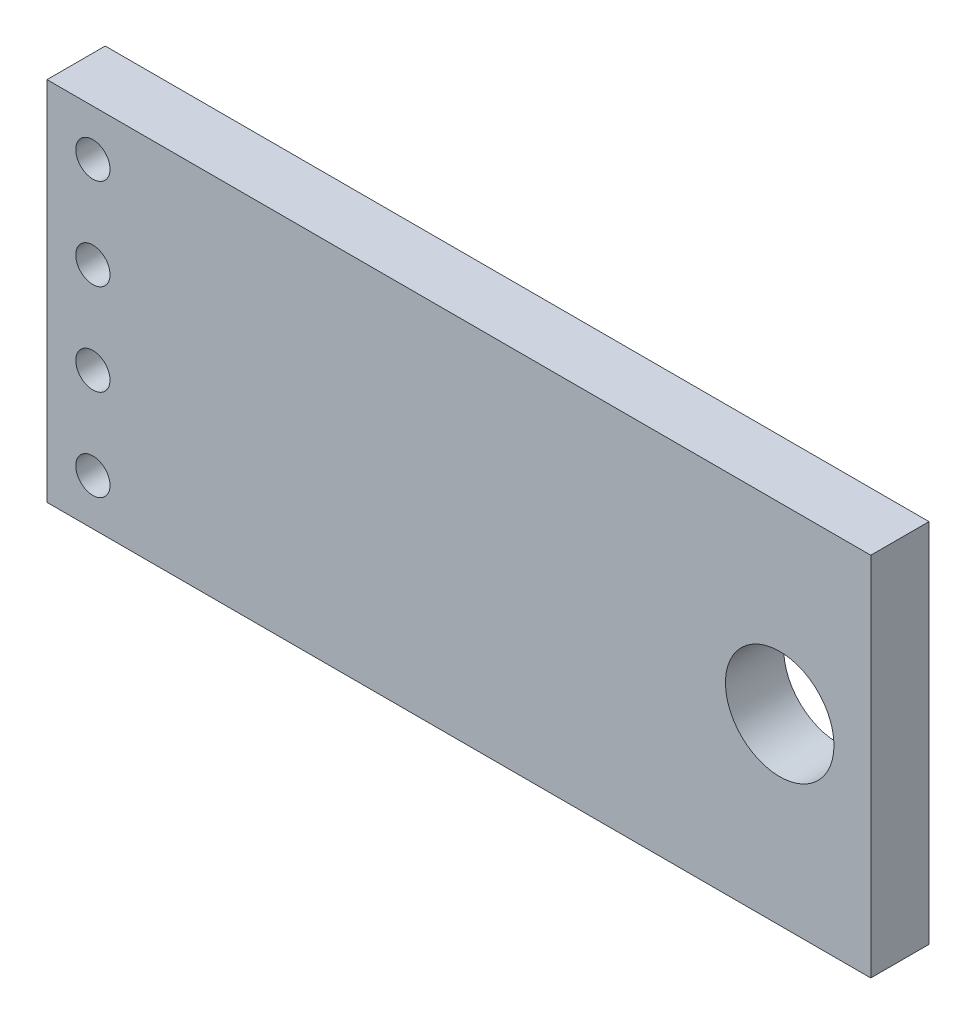
ISO-10303-21;
HEADER;
FILE_DESCRIPTION(('STEP AP214'),'2;1');
FILE_NAME('part.step','',(''),(''),'','','');
FILE_SCHEMA(('AUTOMOTIVE_DESIGN { 1 0 10303 214 1 1 1 1 }'));
ENDSEC;
DATA;
#1=APPLICATION_CONTEXT('core data for automotive mechanical design processes');
#2=APPLICATION_PROTOCOL_DEFINITION('international standard','automotive_design',2000,#1);
#3=PRODUCT_CONTEXT('',#1,'mechanical');
#4=PRODUCT('Part','Part','',(#3));
#5=PRODUCT_RELATED_PRODUCT_CATEGORY('part','',(#4));
#6=PRODUCT_DEFINITION_FORMATION('','',#4);
#7=PRODUCT_DEFINITION_CONTEXT('part definition',#1,'design');
#8=PRODUCT_DEFINITION('design','',#6,#7);
#9=PRODUCT_DEFINITION_SHAPE('','',#8);
#10=(LENGTH_UNIT() NAMED_UNIT(*) SI_UNIT(.MILLI.,.METRE.));
#11=(NAMED_UNIT(*) PLANE_ANGLE_UNIT() SI_UNIT($,.RADIAN.));
#12=(NAMED_UNIT(*) SI_UNIT($,.STERADIAN.) SOLID_ANGLE_UNIT());
#13=UNCERTAINTY_MEASURE_WITH_UNIT(LENGTH_MEASURE(1.E-05),#10,'distance_accuracy_value','');
#14=(GEOMETRIC_REPRESENTATION_CONTEXT(3) GLOBAL_UNCERTAINTY_ASSIGNED_CONTEXT((#13)) GLOBAL_UNIT_ASSIGNED_CONTEXT((#10,
#11,#12)) REPRESENTATION_CONTEXT('',''));
#15=CARTESIAN_POINT('',(0.,0.,0.));
#16=DIRECTION('',(0.,0.,1.));
#17=DIRECTION('',(1.,0.,0.));
#18=AXIS2_PLACEMENT_3D('',#15,#16,#17);
#19=CARTESIAN_POINT('',(0.,0.,0.81));
#20=DIRECTION('',(0.,0.,1.));
#21=DIRECTION('',(1.,0.,0.));
#22=AXIS2_PLACEMENT_3D('',#19,#20,#21);
#23=PLANE('',#22);
#24=CARTESIAN_POINT('',(20.3837838256145,5.09210302801768,0.81));
#25=DIRECTION('',(0.,0.,1.));
#26=DIRECTION('',(1.,0.,0.));
#27=AXIS2_PLACEMENT_3D('',#24,#25,#26);
#28=CIRCLE('',#27,1.50984702299712);
#29=CARTESIAN_POINT('',(21.8936308486116,5.09210302801768,0.81));
#30=VERTEX_POINT('',#29);
#31=EDGE_CURVE('E128',#30,#30,#28,.T.);
#32=ORIENTED_EDGE('',*,*,#31,.F.);
#33=EDGE_LOOP('',(#32));
#34=FACE_BOUND('',#33,.T.);
#35=CARTESIAN_POINT('',(1.27648108010855,3.82210302801767,0.81));
#36=DIRECTION('',(0.,0.,1.));
#37=DIRECTION('',(1.,0.,0.));
#38=AXIS2_PLACEMENT_3D('',#35,#36,#37);
#39=CIRCLE('',#38,0.476625594294271);
#40=CARTESIAN_POINT('',(1.75310667440282,3.82210302801767,0.81));
#41=VERTEX_POINT('',#40);
#42=EDGE_CURVE('E116',#41,#41,#39,.T.);
#43=ORIENTED_EDGE('',*,*,#42,.F.);
#44=EDGE_LOOP('',(#43));
#45=FACE_BOUND('',#44,.T.);
#46=DIRECTION('',(0.,-1.,0.));
#47=VECTOR('',#46,1.);
#48=CARTESIAN_POINT('',(-1.4830043236109E-05,-0.000689100541689467,0.81));
#49=LINE('',#48,#47);
#50=CARTESIAN_POINT('',(-1.48300432362066E-05,10.184895156577,0.81));
#51=VERTEX_POINT('',#50);
#52=CARTESIAN_POINT('',(-1.4830043236109E-05,-0.000689100541689467,0.81));
#53=VERTEX_POINT('',#52);
#54=EDGE_CURVE('E86',#51,#53,#49,.T.);
#55=ORIENTED_EDGE('',*,*,#54,.T.);
#56=DIRECTION('',(1.,0.,0.));
#57=VECTOR('',#56,1.);
#58=CARTESIAN_POINT('',(22.9171546912782,-0.000689100541689467,0.81));
#59=LINE('',#58,#57);
#60=CARTESIAN_POINT('',(22.9171546912782,-0.000689100541689467,0.81));
#61=VERTEX_POINT('',#60);
#62=EDGE_CURVE('E81',#53,#61,#59,.T.);
#63=ORIENTED_EDGE('',*,*,#62,.T.);
#64=DIRECTION('',(0.,1.,0.));
#65=VECTOR('',#64,1.);
#66=CARTESIAN_POINT('',(22.9171546912782,-0.000689100541689467,0.81));
#67=LINE('',#66,#65);
#68=CARTESIAN_POINT('',(22.9171546912782,10.184895156577,0.81));
#69=VERTEX_POINT('',#68);
#70=EDGE_CURVE('E84',#61,#69,#67,.T.);
#71=ORIENTED_EDGE('',*,*,#70,.T.);
#72=DIRECTION('',(-1.,0.,0.));
#73=VECTOR('',#72,1.);
#74=CARTESIAN_POINT('',(22.9171546912782,10.184895156577,0.81));
#75=LINE('',#74,#73);
#76=EDGE_CURVE('E51',#69,#51,#75,.T.);
#77=ORIENTED_EDGE('',*,*,#76,.T.);
#78=EDGE_LOOP('',(#55,#63,#71,#77));
#79=FACE_BOUND('',#78,.T.);
#80=CARTESIAN_POINT('',(1.27648108010855,8.90210302801768,0.81));
#81=DIRECTION('',(0.,0.,1.));
#82=DIRECTION('',(1.,0.,0.));
#83=AXIS2_PLACEMENT_3D('',#80,#81,#82);
#84=CIRCLE('',#83,0.476625594294271);
#85=CARTESIAN_POINT('',(1.75310667440282,8.90210302801768,0.81));
#86=VERTEX_POINT('',#85);
#87=EDGE_CURVE('E101',#86,#86,#84,.T.);
#88=ORIENTED_EDGE('',*,*,#87,.F.);
#89=EDGE_LOOP('',(#88));
#90=FACE_BOUND('',#89,.T.);
#91=CARTESIAN_POINT('',(1.27648108010855,6.36210302801767,0.81));
#92=DIRECTION('',(0.,0.,1.));
#93=DIRECTION('',(1.,0.,0.));
#94=AXIS2_PLACEMENT_3D('',#91,#92,#93);
#95=CIRCLE('',#94,0.476625594294271);
#96=CARTESIAN_POINT('',(1.75310667440282,6.36210302801767,0.81));
#97=VERTEX_POINT('',#96);
#98=EDGE_CURVE('E122',#97,#97,#95,.T.);
#99=ORIENTED_EDGE('',*,*,#98,.F.);
#100=EDGE_LOOP('',(#99));
#101=FACE_BOUND('',#100,.T.);
#102=CARTESIAN_POINT('',(1.27648108010855,1.28210302801767,0.81));
#103=DIRECTION('',(0.,0.,1.));
#104=DIRECTION('',(1.,0.,0.));
#105=AXIS2_PLACEMENT_3D('',#102,#103,#104);
#106=CIRCLE('',#105,0.47662559429427);
#107=CARTESIAN_POINT('',(1.75310667440282,1.28210302801767,0.81));
#108=VERTEX_POINT('',#107);
#109=EDGE_CURVE('E134',#108,#108,#106,.T.);
#110=ORIENTED_EDGE('',*,*,#109,.F.);
#111=EDGE_LOOP('',(#110));
#112=FACE_BOUND('',#111,.T.);
#113=ADVANCED_FACE('F34',(#34,#45,#79,#90,#101,#112),#23,.T.);
#114=CARTESIAN_POINT('',(0.,0.,-0.81));
#115=DIRECTION('',(0.,0.,1.));
#116=DIRECTION('',(1.,0.,0.));
#117=AXIS2_PLACEMENT_3D('',#114,#115,#116);
#118=PLANE('',#117);
#119=DIRECTION('',(0.,-1.,0.));
#120=VECTOR('',#119,1.);
#121=CARTESIAN_POINT('',(-1.4830043236109E-05,-0.000689100541689467,-0.81));
#122=LINE('',#121,#120);
#123=CARTESIAN_POINT('',(-1.48300432362066E-05,10.184895156577,-0.81));
#124=VERTEX_POINT('',#123);
#125=CARTESIAN_POINT('',(-1.4830043236109E-05,-0.000689100541689467,-0.81));
#126=VERTEX_POINT('',#125);
#127=EDGE_CURVE('E98',#124,#126,#122,.T.);
#128=ORIENTED_EDGE('',*,*,#127,.F.);
#129=DIRECTION('',(-1.,0.,0.));
#130=VECTOR('',#129,1.);
#131=CARTESIAN_POINT('',(22.9171546912782,10.184895156577,-0.81));
#132=LINE('',#131,#130);
#133=CARTESIAN_POINT('',(22.9171546912782,10.184895156577,-0.81));
#134=VERTEX_POINT('',#133);
#135=EDGE_CURVE('E74',#134,#124,#132,.T.);
#136=ORIENTED_EDGE('',*,*,#135,.F.);
#137=DIRECTION('',(0.,1.,0.));
#138=VECTOR('',#137,1.);
#139=CARTESIAN_POINT('',(22.9171546912782,-0.000689100541689467,-0.81));
#140=LINE('',#139,#138);
#141=CARTESIAN_POINT('',(22.9171546912782,-0.000689100541689467,-0.81));
#142=VERTEX_POINT('',#141);
#143=EDGE_CURVE('E68',#142,#134,#140,.T.);
#144=ORIENTED_EDGE('',*,*,#143,.F.);
#145=DIRECTION('',(1.,0.,0.));
#146=VECTOR('',#145,1.);
#147=CARTESIAN_POINT('',(22.9171546912782,-0.000689100541689467,-0.81));
#148=LINE('',#147,#146);
#149=EDGE_CURVE('E90',#126,#142,#148,.T.);
#150=ORIENTED_EDGE('',*,*,#149,.F.);
#151=EDGE_LOOP('',(#128,#136,#144,#150));
#152=FACE_BOUND('',#151,.T.);
#153=CARTESIAN_POINT('',(1.27648108010855,8.90210302801768,-0.81));
#154=DIRECTION('',(0.,0.,1.));
#155=DIRECTION('',(1.,0.,0.));
#156=AXIS2_PLACEMENT_3D('',#153,#154,#155);
#157=CIRCLE('',#156,0.476625594294271);
#158=CARTESIAN_POINT('',(1.75310667440282,8.90210302801768,-0.81));
#159=VERTEX_POINT('',#158);
#160=EDGE_CURVE('E113',#159,#159,#157,.T.);
#161=ORIENTED_EDGE('',*,*,#160,.T.);
#162=EDGE_LOOP('',(#161));
#163=FACE_BOUND('',#162,.T.);
#164=CARTESIAN_POINT('',(1.27648108010855,3.82210302801767,-0.81));
#165=DIRECTION('',(0.,0.,1.));
#166=DIRECTION('',(1.,0.,0.));
#167=AXIS2_PLACEMENT_3D('',#164,#165,#166);
#168=CIRCLE('',#167,0.476625594294271);
#169=CARTESIAN_POINT('',(1.75310667440282,3.82210302801767,-0.81));
#170=VERTEX_POINT('',#169);
#171=EDGE_CURVE('E119',#170,#170,#168,.T.);
#172=ORIENTED_EDGE('',*,*,#171,.T.);
#173=EDGE_LOOP('',(#172));
#174=FACE_BOUND('',#173,.T.);
#175=CARTESIAN_POINT('',(1.27648108010855,6.36210302801767,-0.81));
#176=DIRECTION('',(0.,0.,1.));
#177=DIRECTION('',(1.,0.,0.));
#178=AXIS2_PLACEMENT_3D('',#175,#176,#177);
#179=CIRCLE('',#178,0.476625594294271);
#180=CARTESIAN_POINT('',(1.75310667440282,6.36210302801767,-0.81));
#181=VERTEX_POINT('',#180);
#182=EDGE_CURVE('E125',#181,#181,#179,.T.);
#183=ORIENTED_EDGE('',*,*,#182,.T.);
#184=EDGE_LOOP('',(#183));
#185=FACE_BOUND('',#184,.T.);
#186=CARTESIAN_POINT('',(20.3837838256145,5.09210302801768,-0.81));
#187=DIRECTION('',(0.,0.,1.));
#188=DIRECTION('',(1.,0.,0.));
#189=AXIS2_PLACEMENT_3D('',#186,#187,#188);
#190=CIRCLE('',#189,1.50984702299712);
#191=CARTESIAN_POINT('',(21.8936308486116,5.09210302801768,-0.81));
#192=VERTEX_POINT('',#191);
#193=EDGE_CURVE('E131',#192,#192,#190,.T.);
#194=ORIENTED_EDGE('',*,*,#193,.T.);
#195=EDGE_LOOP('',(#194));
#196=FACE_BOUND('',#195,.T.);
#197=CARTESIAN_POINT('',(1.27648108010855,1.28210302801767,-0.81));
#198=DIRECTION('',(0.,0.,1.));
#199=DIRECTION('',(1.,0.,0.));
#200=AXIS2_PLACEMENT_3D('',#197,#198,#199);
#201=CIRCLE('',#200,0.47662559429427);
#202=CARTESIAN_POINT('',(1.75310667440282,1.28210302801767,-0.81));
#203=VERTEX_POINT('',#202);
#204=EDGE_CURVE('E137',#203,#203,#201,.T.);
#205=ORIENTED_EDGE('',*,*,#204,.T.);
#206=EDGE_LOOP('',(#205));
#207=FACE_BOUND('',#206,.T.);
#208=ADVANCED_FACE('F109',(#152,#163,#174,#185,#196,#207),#118,.F.);
#209=CARTESIAN_POINT('',(-1.4830043236109E-05,-0.000689100541689467,0.81));
#210=DIRECTION('',(1.,0.,0.));
#211=DIRECTION('',(0.,1.,0.));
#212=AXIS2_PLACEMENT_3D('',#209,#210,#211);
#213=PLANE('',#212);
#214=ORIENTED_EDGE('',*,*,#127,.T.);
#215=DIRECTION('',(0.,0.,-1.));
#216=VECTOR('',#215,1.);
#217=CARTESIAN_POINT('',(-1.4830043236109E-05,-0.000689100541689467,0.81));
#218=LINE('',#217,#216);
#219=EDGE_CURVE('E11',#53,#126,#218,.T.);
#220=ORIENTED_EDGE('',*,*,#219,.F.);
#221=ORIENTED_EDGE('',*,*,#54,.F.);
#222=DIRECTION('',(0.,0.,-1.));
#223=VECTOR('',#222,1.);
#224=CARTESIAN_POINT('',(-1.48300432362066E-05,10.184895156577,0.81));
#225=LINE('',#224,#223);
#226=EDGE_CURVE('E94',#51,#124,#225,.T.);
#227=ORIENTED_EDGE('',*,*,#226,.T.);
#228=EDGE_LOOP('',(#214,#220,#221,#227));
#229=FACE_BOUND('',#228,.T.);
#230=ADVANCED_FACE('F36',(#229),#213,.F.);
#231=CARTESIAN_POINT('',(22.9171546912782,-0.000689100541689467,0.81));
#232=DIRECTION('',(0.,1.,0.));
#233=DIRECTION('',(0.,0.,1.));
#234=AXIS2_PLACEMENT_3D('',#231,#232,#233);
#235=PLANE('',#234);
#236=ORIENTED_EDGE('',*,*,#149,.T.);
#237=DIRECTION('',(0.,0.,-1.));
#238=VECTOR('',#237,1.);
#239=CARTESIAN_POINT('',(22.9171546912782,-0.000689100541689467,0.81));
#240=LINE('',#239,#238);
#241=EDGE_CURVE('E43',#61,#142,#240,.T.);
#242=ORIENTED_EDGE('',*,*,#241,.F.);
#243=ORIENTED_EDGE('',*,*,#62,.F.);
#244=ORIENTED_EDGE('',*,*,#219,.T.);
#245=EDGE_LOOP('',(#236,#242,#243,#244));
#246=FACE_BOUND('',#245,.T.);
#247=ADVANCED_FACE('F89',(#246),#235,.F.);
#248=CARTESIAN_POINT('',(22.9171546912782,-0.000689100541689467,0.81));
#249=DIRECTION('',(-1.,0.,0.));
#250=DIRECTION('',(0.,0.,1.));
#251=AXIS2_PLACEMENT_3D('',#248,#249,#250);
#252=PLANE('',#251);
#253=ORIENTED_EDGE('',*,*,#143,.T.);
#254=DIRECTION('',(0.,0.,-1.));
#255=VECTOR('',#254,1.);
#256=CARTESIAN_POINT('',(22.9171546912782,10.184895156577,0.81));
#257=LINE('',#256,#255);
#258=EDGE_CURVE('E91',#69,#134,#257,.T.);
#259=ORIENTED_EDGE('',*,*,#258,.F.);
#260=ORIENTED_EDGE('',*,*,#70,.F.);
#261=ORIENTED_EDGE('',*,*,#241,.T.);
#262=EDGE_LOOP('',(#253,#259,#260,#261));
#263=FACE_BOUND('',#262,.T.);
#264=ADVANCED_FACE('F92',(#263),#252,.F.);
#265=CARTESIAN_POINT('',(22.9171546912782,10.184895156577,0.81));
#266=DIRECTION('',(0.,-1.,0.));
#267=DIRECTION('',(1.,0.,0.));
#268=AXIS2_PLACEMENT_3D('',#265,#266,#267);
#269=PLANE('',#268);
#270=ORIENTED_EDGE('',*,*,#135,.T.);
#271=ORIENTED_EDGE('',*,*,#226,.F.);
#272=ORIENTED_EDGE('',*,*,#76,.F.);
#273=ORIENTED_EDGE('',*,*,#258,.T.);
#274=EDGE_LOOP('',(#270,#271,#272,#273));
#275=FACE_BOUND('',#274,.T.);
#276=ADVANCED_FACE('F106',(#275),#269,.F.);
#277=CARTESIAN_POINT('',(1.27648108010855,8.90210302801768,0.81));
#278=DIRECTION('',(0.,0.,-1.));
#279=DIRECTION('',(-1.,0.,0.));
#280=AXIS2_PLACEMENT_3D('',#277,#278,#279);
#281=CYLINDRICAL_SURFACE('',#280,0.476625594294271);
#282=ORIENTED_EDGE('',*,*,#87,.T.);
#283=EDGE_LOOP('',(#282));
#284=FACE_BOUND('',#283,.T.);
#285=ORIENTED_EDGE('',*,*,#160,.F.);
#286=EDGE_LOOP('',(#285));
#287=FACE_BOUND('',#286,.T.);
#288=ADVANCED_FACE('F156',(#284,#287),#281,.F.);
#289=CARTESIAN_POINT('',(1.27648108010855,3.82210302801767,0.81));
#290=DIRECTION('',(0.,0.,-1.));
#291=DIRECTION('',(-1.,0.,0.));
#292=AXIS2_PLACEMENT_3D('',#289,#290,#291);
#293=CYLINDRICAL_SURFACE('',#292,0.476625594294271);
#294=ORIENTED_EDGE('',*,*,#42,.T.);
#295=EDGE_LOOP('',(#294));
#296=FACE_BOUND('',#295,.T.);
#297=ORIENTED_EDGE('',*,*,#171,.F.);
#298=EDGE_LOOP('',(#297));
#299=FACE_BOUND('',#298,.T.);
#300=ADVANCED_FACE('F202',(#296,#299),#293,.F.);
#301=CARTESIAN_POINT('',(1.27648108010855,6.36210302801767,0.81));
#302=DIRECTION('',(0.,0.,-1.));
#303=DIRECTION('',(-1.,0.,0.));
#304=AXIS2_PLACEMENT_3D('',#301,#302,#303);
#305=CYLINDRICAL_SURFACE('',#304,0.476625594294271);
#306=ORIENTED_EDGE('',*,*,#98,.T.);
#307=EDGE_LOOP('',(#306));
#308=FACE_BOUND('',#307,.T.);
#309=ORIENTED_EDGE('',*,*,#182,.F.);
#310=EDGE_LOOP('',(#309));
#311=FACE_BOUND('',#310,.T.);
#312=ADVANCED_FACE('F210',(#308,#311),#305,.F.);
#313=CARTESIAN_POINT('',(20.3837838256145,5.09210302801768,0.81));
#314=DIRECTION('',(0.,0.,-1.));
#315=DIRECTION('',(-1.,0.,0.));
#316=AXIS2_PLACEMENT_3D('',#313,#314,#315);
#317=CYLINDRICAL_SURFACE('',#316,1.50984702299712);
#318=ORIENTED_EDGE('',*,*,#31,.T.);
#319=EDGE_LOOP('',(#318));
#320=FACE_BOUND('',#319,.T.);
#321=ORIENTED_EDGE('',*,*,#193,.F.);
#322=EDGE_LOOP('',(#321));
#323=FACE_BOUND('',#322,.T.);
#324=ADVANCED_FACE('F218',(#320,#323),#317,.F.);
#325=CARTESIAN_POINT('',(1.27648108010855,1.28210302801767,0.81));
#326=DIRECTION('',(0.,0.,-1.));
#327=DIRECTION('',(-1.,0.,0.));
#328=AXIS2_PLACEMENT_3D('',#325,#326,#327);
#329=CYLINDRICAL_SURFACE('',#328,0.47662559429427);
#330=ORIENTED_EDGE('',*,*,#109,.T.);
#331=EDGE_LOOP('',(#330));
#332=FACE_BOUND('',#331,.T.);
#333=ORIENTED_EDGE('',*,*,#204,.F.);
#334=EDGE_LOOP('',(#333));
#335=FACE_BOUND('',#334,.T.);
#336=ADVANCED_FACE('F143',(#332,#335),#329,.F.);
#337=CLOSED_SHELL('',(#113,#208,#230,#247,#264,#276,#288,#300,#312,#324,#336));
#338=MANIFOLD_SOLID_BREP('B2',#337);
#339=ADVANCED_BREP_SHAPE_REPRESENTATION('',(#18,#338),#14);
#340=SHAPE_DEFINITION_REPRESENTATION(#9,#339);
ENDSEC;
END-ISO-10303-21;
